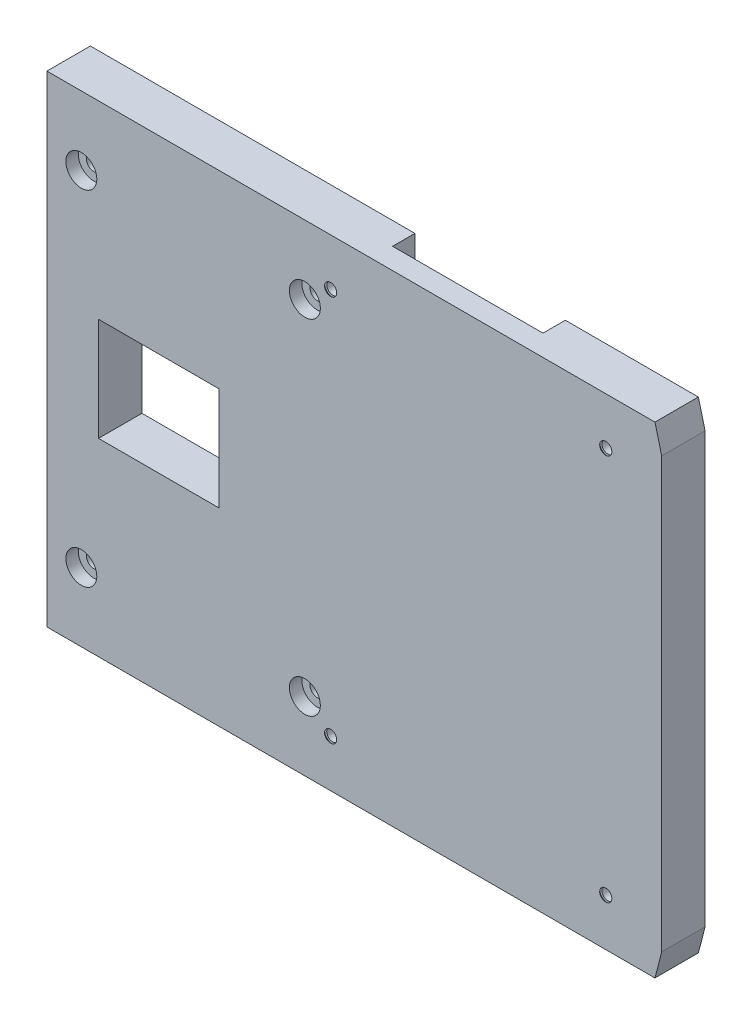
ISO-10303-21;
HEADER;
FILE_DESCRIPTION(('STEP AP214'),'2;1');
FILE_NAME('part.step','',(''),(''),'','','');
FILE_SCHEMA(('AUTOMOTIVE_DESIGN { 1 0 10303 214 1 1 1 1 }'));
ENDSEC;
DATA;
#1=APPLICATION_CONTEXT('core data for automotive mechanical design processes');
#2=APPLICATION_PROTOCOL_DEFINITION('international standard','automotive_design',2000,#1);
#3=PRODUCT_CONTEXT('',#1,'mechanical');
#4=PRODUCT('Part','Part','',(#3));
#5=PRODUCT_RELATED_PRODUCT_CATEGORY('part','',(#4));
#6=PRODUCT_DEFINITION_FORMATION('','',#4);
#7=PRODUCT_DEFINITION_CONTEXT('part definition',#1,'design');
#8=PRODUCT_DEFINITION('design','',#6,#7);
#9=PRODUCT_DEFINITION_SHAPE('','',#8);
#10=(LENGTH_UNIT() NAMED_UNIT(*) SI_UNIT(.MILLI.,.METRE.));
#11=(NAMED_UNIT(*) PLANE_ANGLE_UNIT() SI_UNIT($,.RADIAN.));
#12=(NAMED_UNIT(*) SI_UNIT($,.STERADIAN.) SOLID_ANGLE_UNIT());
#13=UNCERTAINTY_MEASURE_WITH_UNIT(LENGTH_MEASURE(1.E-05),#10,'distance_accuracy_value','');
#14=(GEOMETRIC_REPRESENTATION_CONTEXT(3) GLOBAL_UNCERTAINTY_ASSIGNED_CONTEXT((#13)) GLOBAL_UNIT_ASSIGNED_CONTEXT((#10,
#11,#12)) REPRESENTATION_CONTEXT('',''));
#15=CARTESIAN_POINT('',(0.,0.,0.));
#16=DIRECTION('',(0.,0.,1.));
#17=DIRECTION('',(1.,0.,0.));
#18=AXIS2_PLACEMENT_3D('',#15,#16,#17);
#19=CARTESIAN_POINT('',(192.,45.,221.61));
#20=DIRECTION('',(0.,0.,1.));
#21=DIRECTION('',(1.,0.,0.));
#22=AXIS2_PLACEMENT_3D('',#19,#20,#21);
#23=PLANE('',#22);
#24=CARTESIAN_POINT('',(192.,45.,221.61));
#25=DIRECTION('',(0.,0.,1.));
#26=DIRECTION('',(1.,0.,0.));
#27=AXIS2_PLACEMENT_3D('',#24,#25,#26);
#28=CIRCLE('',#27,1.4);
#29=CARTESIAN_POINT('',(193.4,45.,221.61));
#30=VERTEX_POINT('',#29);
#31=EDGE_CURVE('E9',#30,#30,#28,.T.);
#32=ORIENTED_EDGE('',*,*,#31,.F.);
#33=EDGE_LOOP('',(#32));
#34=FACE_BOUND('',#33,.T.);
#35=CARTESIAN_POINT('',(192.,45.,221.61));
#36=DIRECTION('',(0.,0.,1.));
#37=DIRECTION('',(1.,0.,0.));
#38=AXIS2_PLACEMENT_3D('',#35,#36,#37);
#39=CIRCLE('',#38,1.9);
#40=CARTESIAN_POINT('',(193.9,45.,221.61));
#41=VERTEX_POINT('',#40);
#42=EDGE_CURVE('E283',#41,#41,#39,.T.);
#43=ORIENTED_EDGE('',*,*,#42,.T.);
#44=EDGE_LOOP('',(#43));
#45=FACE_BOUND('',#44,.T.);
#46=ADVANCED_FACE('F14',(#34,#45),#23,.T.);
#47=CARTESIAN_POINT('',(128.,45.,221.61));
#48=DIRECTION('',(0.,0.,1.));
#49=DIRECTION('',(1.,0.,0.));
#50=AXIS2_PLACEMENT_3D('',#47,#48,#49);
#51=PLANE('',#50);
#52=CARTESIAN_POINT('',(128.,45.,221.61));
#53=DIRECTION('',(0.,0.,1.));
#54=DIRECTION('',(1.,0.,0.));
#55=AXIS2_PLACEMENT_3D('',#52,#53,#54);
#56=CIRCLE('',#55,1.4);
#57=CARTESIAN_POINT('',(129.4,45.,221.61));
#58=VERTEX_POINT('',#57);
#59=EDGE_CURVE('E253',#58,#58,#56,.T.);
#60=ORIENTED_EDGE('',*,*,#59,.F.);
#61=EDGE_LOOP('',(#60));
#62=FACE_BOUND('',#61,.T.);
#63=CARTESIAN_POINT('',(128.,45.,221.61));
#64=DIRECTION('',(0.,0.,1.));
#65=DIRECTION('',(1.,0.,0.));
#66=AXIS2_PLACEMENT_3D('',#63,#64,#65);
#67=CIRCLE('',#66,1.9);
#68=CARTESIAN_POINT('',(129.9,45.,221.61));
#69=VERTEX_POINT('',#68);
#70=EDGE_CURVE('E425',#69,#69,#67,.T.);
#71=ORIENTED_EDGE('',*,*,#70,.T.);
#72=EDGE_LOOP('',(#71));
#73=FACE_BOUND('',#72,.T.);
#74=ADVANCED_FACE('F661',(#62,#73),#51,.T.);
#75=CARTESIAN_POINT('',(122.,40.,219.2));
#76=DIRECTION('',(0.,0.,1.));
#77=DIRECTION('',(1.,0.,0.));
#78=AXIS2_PLACEMENT_3D('',#75,#76,#77);
#79=PLANE('',#78);
#80=CARTESIAN_POINT('',(122.,40.,219.2));
#81=DIRECTION('',(0.,0.,1.));
#82=DIRECTION('',(1.,0.,0.));
#83=AXIS2_PLACEMENT_3D('',#80,#81,#82);
#84=CIRCLE('',#83,1.7);
#85=CARTESIAN_POINT('',(123.7,40.,219.2));
#86=VERTEX_POINT('',#85);
#87=EDGE_CURVE('E238',#86,#86,#84,.T.);
#88=ORIENTED_EDGE('',*,*,#87,.F.);
#89=EDGE_LOOP('',(#88));
#90=FACE_BOUND('',#89,.T.);
#91=CARTESIAN_POINT('',(122.,40.,219.2));
#92=DIRECTION('',(0.,0.,1.));
#93=DIRECTION('',(1.,0.,0.));
#94=AXIS2_PLACEMENT_3D('',#91,#92,#93);
#95=CIRCLE('',#94,3.6);
#96=CARTESIAN_POINT('',(125.6,40.,219.2));
#97=VERTEX_POINT('',#96);
#98=EDGE_CURVE('E426',#97,#97,#95,.T.);
#99=ORIENTED_EDGE('',*,*,#98,.T.);
#100=EDGE_LOOP('',(#99));
#101=FACE_BOUND('',#100,.T.);
#102=ADVANCED_FACE('F667',(#90,#101),#79,.T.);
#103=CARTESIAN_POINT('',(70.,40.,219.2));
#104=DIRECTION('',(0.,0.,1.));
#105=DIRECTION('',(1.,0.,0.));
#106=AXIS2_PLACEMENT_3D('',#103,#104,#105);
#107=PLANE('',#106);
#108=CARTESIAN_POINT('',(70.,40.,219.2));
#109=DIRECTION('',(0.,0.,1.));
#110=DIRECTION('',(1.,0.,0.));
#111=AXIS2_PLACEMENT_3D('',#108,#109,#110);
#112=CIRCLE('',#111,1.7);
#113=CARTESIAN_POINT('',(71.7,40.,219.2));
#114=VERTEX_POINT('',#113);
#115=EDGE_CURVE('E255',#114,#114,#112,.T.);
#116=ORIENTED_EDGE('',*,*,#115,.F.);
#117=EDGE_LOOP('',(#116));
#118=FACE_BOUND('',#117,.T.);
#119=CARTESIAN_POINT('',(70.,40.,219.2));
#120=DIRECTION('',(0.,0.,1.));
#121=DIRECTION('',(1.,0.,0.));
#122=AXIS2_PLACEMENT_3D('',#119,#120,#121);
#123=CIRCLE('',#122,3.6);
#124=CARTESIAN_POINT('',(73.6,40.,219.2));
#125=VERTEX_POINT('',#124);
#126=EDGE_CURVE('E359',#125,#125,#123,.T.);
#127=ORIENTED_EDGE('',*,*,#126,.T.);
#128=EDGE_LOOP('',(#127));
#129=FACE_BOUND('',#128,.T.);
#130=ADVANCED_FACE('F571',(#118,#129),#107,.T.);
#131=CARTESIAN_POINT('',(192.,-45.,221.61));
#132=DIRECTION('',(0.,0.,1.));
#133=DIRECTION('',(1.,0.,0.));
#134=AXIS2_PLACEMENT_3D('',#131,#132,#133);
#135=PLANE('',#134);
#136=CARTESIAN_POINT('',(192.,-45.,221.61));
#137=DIRECTION('',(0.,0.,1.));
#138=DIRECTION('',(1.,0.,0.));
#139=AXIS2_PLACEMENT_3D('',#136,#137,#138);
#140=CIRCLE('',#139,1.4);
#141=CARTESIAN_POINT('',(193.4,-45.,221.61));
#142=VERTEX_POINT('',#141);
#143=EDGE_CURVE('E442',#142,#142,#140,.T.);
#144=ORIENTED_EDGE('',*,*,#143,.F.);
#145=EDGE_LOOP('',(#144));
#146=FACE_BOUND('',#145,.T.);
#147=CARTESIAN_POINT('',(192.,-45.,221.61));
#148=DIRECTION('',(0.,0.,1.));
#149=DIRECTION('',(1.,0.,0.));
#150=AXIS2_PLACEMENT_3D('',#147,#148,#149);
#151=CIRCLE('',#150,1.9);
#152=CARTESIAN_POINT('',(193.9,-45.,221.61));
#153=VERTEX_POINT('',#152);
#154=EDGE_CURVE('E350',#153,#153,#151,.T.);
#155=ORIENTED_EDGE('',*,*,#154,.T.);
#156=EDGE_LOOP('',(#155));
#157=FACE_BOUND('',#156,.T.);
#158=ADVANCED_FACE('F567',(#146,#157),#135,.T.);
#159=CARTESIAN_POINT('',(122.,-40.,219.2));
#160=DIRECTION('',(0.,0.,1.));
#161=DIRECTION('',(1.,0.,0.));
#162=AXIS2_PLACEMENT_3D('',#159,#160,#161);
#163=PLANE('',#162);
#164=CARTESIAN_POINT('',(122.,-40.,219.2));
#165=DIRECTION('',(0.,0.,1.));
#166=DIRECTION('',(1.,0.,0.));
#167=AXIS2_PLACEMENT_3D('',#164,#165,#166);
#168=CIRCLE('',#167,1.7);
#169=CARTESIAN_POINT('',(123.7,-40.,219.2));
#170=VERTEX_POINT('',#169);
#171=EDGE_CURVE('E293',#170,#170,#168,.T.);
#172=ORIENTED_EDGE('',*,*,#171,.F.);
#173=EDGE_LOOP('',(#172));
#174=FACE_BOUND('',#173,.T.);
#175=CARTESIAN_POINT('',(122.,-40.,219.2));
#176=DIRECTION('',(0.,0.,1.));
#177=DIRECTION('',(1.,0.,0.));
#178=AXIS2_PLACEMENT_3D('',#175,#176,#177);
#179=CIRCLE('',#178,3.6);
#180=CARTESIAN_POINT('',(125.6,-40.,219.2));
#181=VERTEX_POINT('',#180);
#182=EDGE_CURVE('E318',#181,#181,#179,.T.);
#183=ORIENTED_EDGE('',*,*,#182,.T.);
#184=EDGE_LOOP('',(#183));
#185=FACE_BOUND('',#184,.T.);
#186=ADVANCED_FACE('F570',(#174,#185),#163,.T.);
#187=CARTESIAN_POINT('',(128.,-45.,221.61));
#188=DIRECTION('',(0.,0.,1.));
#189=DIRECTION('',(1.,0.,0.));
#190=AXIS2_PLACEMENT_3D('',#187,#188,#189);
#191=PLANE('',#190);
#192=CARTESIAN_POINT('',(128.,-45.,221.61));
#193=DIRECTION('',(0.,0.,1.));
#194=DIRECTION('',(1.,0.,0.));
#195=AXIS2_PLACEMENT_3D('',#192,#193,#194);
#196=CIRCLE('',#195,1.4);
#197=CARTESIAN_POINT('',(129.4,-45.,221.61));
#198=VERTEX_POINT('',#197);
#199=EDGE_CURVE('E302',#198,#198,#196,.T.);
#200=ORIENTED_EDGE('',*,*,#199,.F.);
#201=EDGE_LOOP('',(#200));
#202=FACE_BOUND('',#201,.T.);
#203=CARTESIAN_POINT('',(128.,-45.,221.61));
#204=DIRECTION('',(0.,0.,1.));
#205=DIRECTION('',(1.,0.,0.));
#206=AXIS2_PLACEMENT_3D('',#203,#204,#205);
#207=CIRCLE('',#206,1.9);
#208=CARTESIAN_POINT('',(129.9,-45.,221.61));
#209=VERTEX_POINT('',#208);
#210=EDGE_CURVE('E319',#209,#209,#207,.T.);
#211=ORIENTED_EDGE('',*,*,#210,.T.);
#212=EDGE_LOOP('',(#211));
#213=FACE_BOUND('',#212,.T.);
#214=ADVANCED_FACE('F1008',(#202,#213),#191,.T.);
#215=CARTESIAN_POINT('',(70.,-40.,219.2));
#216=DIRECTION('',(0.,0.,1.));
#217=DIRECTION('',(1.,0.,0.));
#218=AXIS2_PLACEMENT_3D('',#215,#216,#217);
#219=PLANE('',#218);
#220=CARTESIAN_POINT('',(70.,-40.,219.2));
#221=DIRECTION('',(0.,0.,1.));
#222=DIRECTION('',(1.,0.,0.));
#223=AXIS2_PLACEMENT_3D('',#220,#221,#222);
#224=CIRCLE('',#223,1.7);
#225=CARTESIAN_POINT('',(71.7,-40.,219.2));
#226=VERTEX_POINT('',#225);
#227=EDGE_CURVE('E324',#226,#226,#224,.T.);
#228=ORIENTED_EDGE('',*,*,#227,.F.);
#229=EDGE_LOOP('',(#228));
#230=FACE_BOUND('',#229,.T.);
#231=CARTESIAN_POINT('',(70.,-40.,219.2));
#232=DIRECTION('',(0.,0.,1.));
#233=DIRECTION('',(1.,0.,0.));
#234=AXIS2_PLACEMENT_3D('',#231,#232,#233);
#235=CIRCLE('',#234,3.6);
#236=CARTESIAN_POINT('',(73.6,-40.,219.2));
#237=VERTEX_POINT('',#236);
#238=EDGE_CURVE('E393',#237,#237,#235,.T.);
#239=ORIENTED_EDGE('',*,*,#238,.T.);
#240=EDGE_LOOP('',(#239));
#241=FACE_BOUND('',#240,.T.);
#242=ADVANCED_FACE('F16',(#230,#241),#219,.T.);
#243=CARTESIAN_POINT('',(192.,45.,211.89));
#244=DIRECTION('',(0.,0.,1.));
#245=DIRECTION('',(1.,0.,0.));
#246=AXIS2_PLACEMENT_3D('',#243,#244,#245);
#247=CYLINDRICAL_SURFACE('',#246,1.4);
#248=CARTESIAN_POINT('',(192.,45.,212.));
#249=DIRECTION('',(0.,0.,1.));
#250=DIRECTION('',(1.,0.,0.));
#251=AXIS2_PLACEMENT_3D('',#248,#249,#250);
#252=CIRCLE('',#251,1.4);
#253=CARTESIAN_POINT('',(193.4,45.,212.));
#254=VERTEX_POINT('',#253);
#255=EDGE_CURVE('E511',#254,#254,#252,.T.);
#256=ORIENTED_EDGE('',*,*,#255,.F.);
#257=DIRECTION('',(0.,0.,1.));
#258=VECTOR('',#257,1.);
#259=CARTESIAN_POINT('',(193.4,45.,211.89));
#260=LINE('',#259,#258);
#261=EDGE_CURVE('E25',#254,#30,#260,.T.);
#262=ORIENTED_EDGE('',*,*,#261,.T.);
#263=ORIENTED_EDGE('',*,*,#31,.T.);
#264=ORIENTED_EDGE('',*,*,#261,.F.);
#265=EDGE_LOOP('',(#256,#262,#263,#264));
#266=FACE_BOUND('',#265,.T.);
#267=ADVANCED_FACE('F698',(#266),#247,.F.);
#268=CARTESIAN_POINT('',(192.,-45.,211.89));
#269=DIRECTION('',(0.,0.,1.));
#270=DIRECTION('',(1.,0.,0.));
#271=AXIS2_PLACEMENT_3D('',#268,#269,#270);
#272=CYLINDRICAL_SURFACE('',#271,1.4);
#273=CARTESIAN_POINT('',(192.,-45.,212.));
#274=DIRECTION('',(0.,0.,1.));
#275=DIRECTION('',(1.,0.,0.));
#276=AXIS2_PLACEMENT_3D('',#273,#274,#275);
#277=CIRCLE('',#276,1.4);
#278=CARTESIAN_POINT('',(193.4,-45.,212.));
#279=VERTEX_POINT('',#278);
#280=EDGE_CURVE('E281',#279,#279,#277,.T.);
#281=ORIENTED_EDGE('',*,*,#280,.F.);
#282=DIRECTION('',(0.,0.,1.));
#283=VECTOR('',#282,1.);
#284=CARTESIAN_POINT('',(193.4,-45.,211.89));
#285=LINE('',#284,#283);
#286=EDGE_CURVE('E438',#279,#142,#285,.T.);
#287=ORIENTED_EDGE('',*,*,#286,.T.);
#288=ORIENTED_EDGE('',*,*,#143,.T.);
#289=ORIENTED_EDGE('',*,*,#286,.F.);
#290=EDGE_LOOP('',(#281,#287,#288,#289));
#291=FACE_BOUND('',#290,.T.);
#292=ADVANCED_FACE('F564',(#291),#272,.F.);
#293=CARTESIAN_POINT('',(128.,45.,211.89));
#294=DIRECTION('',(0.,0.,1.));
#295=DIRECTION('',(1.,0.,0.));
#296=AXIS2_PLACEMENT_3D('',#293,#294,#295);
#297=CYLINDRICAL_SURFACE('',#296,1.4);
#298=CARTESIAN_POINT('',(128.,45.,212.));
#299=DIRECTION('',(0.,0.,1.));
#300=DIRECTION('',(1.,0.,0.));
#301=AXIS2_PLACEMENT_3D('',#298,#299,#300);
#302=CIRCLE('',#301,1.4);
#303=CARTESIAN_POINT('',(129.4,45.,212.));
#304=VERTEX_POINT('',#303);
#305=EDGE_CURVE('E346',#304,#304,#302,.T.);
#306=ORIENTED_EDGE('',*,*,#305,.F.);
#307=DIRECTION('',(0.,0.,1.));
#308=VECTOR('',#307,1.);
#309=CARTESIAN_POINT('',(129.4,45.,211.89));
#310=LINE('',#309,#308);
#311=EDGE_CURVE('E245',#304,#58,#310,.T.);
#312=ORIENTED_EDGE('',*,*,#311,.T.);
#313=ORIENTED_EDGE('',*,*,#59,.T.);
#314=ORIENTED_EDGE('',*,*,#311,.F.);
#315=EDGE_LOOP('',(#306,#312,#313,#314));
#316=FACE_BOUND('',#315,.T.);
#317=ADVANCED_FACE('F697',(#316),#297,.F.);
#318=CARTESIAN_POINT('',(122.,40.,211.99));
#319=DIRECTION('',(0.,0.,1.));
#320=DIRECTION('',(1.,0.,0.));
#321=AXIS2_PLACEMENT_3D('',#318,#319,#320);
#322=CYLINDRICAL_SURFACE('',#321,1.7);
#323=CARTESIAN_POINT('',(122.,40.,212.));
#324=DIRECTION('',(0.,0.,1.));
#325=DIRECTION('',(1.,0.,0.));
#326=AXIS2_PLACEMENT_3D('',#323,#324,#325);
#327=CIRCLE('',#326,1.7);
#328=CARTESIAN_POINT('',(123.7,40.,212.));
#329=VERTEX_POINT('',#328);
#330=EDGE_CURVE('E335',#329,#329,#327,.T.);
#331=ORIENTED_EDGE('',*,*,#330,.F.);
#332=DIRECTION('',(0.,0.,1.));
#333=VECTOR('',#332,1.);
#334=CARTESIAN_POINT('',(123.7,40.,211.99));
#335=LINE('',#334,#333);
#336=EDGE_CURVE('E241',#329,#86,#335,.T.);
#337=ORIENTED_EDGE('',*,*,#336,.T.);
#338=ORIENTED_EDGE('',*,*,#87,.T.);
#339=ORIENTED_EDGE('',*,*,#336,.F.);
#340=EDGE_LOOP('',(#331,#337,#338,#339));
#341=FACE_BOUND('',#340,.T.);
#342=ADVANCED_FACE('F240',(#341),#322,.F.);
#343=CARTESIAN_POINT('',(70.,40.,211.99));
#344=DIRECTION('',(0.,0.,1.));
#345=DIRECTION('',(1.,0.,0.));
#346=AXIS2_PLACEMENT_3D('',#343,#344,#345);
#347=CYLINDRICAL_SURFACE('',#346,1.7);
#348=CARTESIAN_POINT('',(70.,40.,212.));
#349=DIRECTION('',(0.,0.,1.));
#350=DIRECTION('',(1.,0.,0.));
#351=AXIS2_PLACEMENT_3D('',#348,#349,#350);
#352=CIRCLE('',#351,1.7);
#353=CARTESIAN_POINT('',(71.7,40.,212.));
#354=VERTEX_POINT('',#353);
#355=EDGE_CURVE('E331',#354,#354,#352,.T.);
#356=ORIENTED_EDGE('',*,*,#355,.F.);
#357=DIRECTION('',(0.,0.,1.));
#358=VECTOR('',#357,1.);
#359=CARTESIAN_POINT('',(71.7,40.,211.99));
#360=LINE('',#359,#358);
#361=EDGE_CURVE('E289',#354,#114,#360,.T.);
#362=ORIENTED_EDGE('',*,*,#361,.T.);
#363=ORIENTED_EDGE('',*,*,#115,.T.);
#364=ORIENTED_EDGE('',*,*,#361,.F.);
#365=EDGE_LOOP('',(#356,#362,#363,#364));
#366=FACE_BOUND('',#365,.T.);
#367=ADVANCED_FACE('F999',(#366),#347,.F.);
#368=CARTESIAN_POINT('',(122.,-40.,211.99));
#369=DIRECTION('',(0.,0.,1.));
#370=DIRECTION('',(1.,0.,0.));
#371=AXIS2_PLACEMENT_3D('',#368,#369,#370);
#372=CYLINDRICAL_SURFACE('',#371,1.7);
#373=CARTESIAN_POINT('',(122.,-40.,212.));
#374=DIRECTION('',(0.,0.,1.));
#375=DIRECTION('',(1.,0.,0.));
#376=AXIS2_PLACEMENT_3D('',#373,#374,#375);
#377=CIRCLE('',#376,1.7);
#378=CARTESIAN_POINT('',(123.7,-40.,212.));
#379=VERTEX_POINT('',#378);
#380=EDGE_CURVE('E481',#379,#379,#377,.T.);
#381=ORIENTED_EDGE('',*,*,#380,.F.);
#382=DIRECTION('',(0.,0.,1.));
#383=VECTOR('',#382,1.);
#384=CARTESIAN_POINT('',(123.7,-40.,211.99));
#385=LINE('',#384,#383);
#386=EDGE_CURVE('E298',#379,#170,#385,.T.);
#387=ORIENTED_EDGE('',*,*,#386,.T.);
#388=ORIENTED_EDGE('',*,*,#171,.T.);
#389=ORIENTED_EDGE('',*,*,#386,.F.);
#390=EDGE_LOOP('',(#381,#387,#388,#389));
#391=FACE_BOUND('',#390,.T.);
#392=ADVANCED_FACE('F1106',(#391),#372,.F.);
#393=CARTESIAN_POINT('',(128.,-45.,211.89));
#394=DIRECTION('',(0.,0.,1.));
#395=DIRECTION('',(1.,0.,0.));
#396=AXIS2_PLACEMENT_3D('',#393,#394,#395);
#397=CYLINDRICAL_SURFACE('',#396,1.4);
#398=CARTESIAN_POINT('',(128.,-45.,212.));
#399=DIRECTION('',(0.,0.,1.));
#400=DIRECTION('',(1.,0.,0.));
#401=AXIS2_PLACEMENT_3D('',#398,#399,#400);
#402=CIRCLE('',#401,1.4);
#403=CARTESIAN_POINT('',(129.4,-45.,212.));
#404=VERTEX_POINT('',#403);
#405=EDGE_CURVE('E373',#404,#404,#402,.T.);
#406=ORIENTED_EDGE('',*,*,#405,.F.);
#407=DIRECTION('',(0.,0.,1.));
#408=VECTOR('',#407,1.);
#409=CARTESIAN_POINT('',(129.4,-45.,211.89));
#410=LINE('',#409,#408);
#411=EDGE_CURVE('E320',#404,#198,#410,.T.);
#412=ORIENTED_EDGE('',*,*,#411,.T.);
#413=ORIENTED_EDGE('',*,*,#199,.T.);
#414=ORIENTED_EDGE('',*,*,#411,.F.);
#415=EDGE_LOOP('',(#406,#412,#413,#414));
#416=FACE_BOUND('',#415,.T.);
#417=ADVANCED_FACE('F1117',(#416),#397,.F.);
#418=CARTESIAN_POINT('',(70.,-40.,211.99));
#419=DIRECTION('',(0.,0.,1.));
#420=DIRECTION('',(1.,0.,0.));
#421=AXIS2_PLACEMENT_3D('',#418,#419,#420);
#422=CYLINDRICAL_SURFACE('',#421,1.7);
#423=CARTESIAN_POINT('',(70.,-40.,212.));
#424=DIRECTION('',(0.,0.,1.));
#425=DIRECTION('',(1.,0.,0.));
#426=AXIS2_PLACEMENT_3D('',#423,#424,#425);
#427=CIRCLE('',#426,1.7);
#428=CARTESIAN_POINT('',(71.7,-40.,212.));
#429=VERTEX_POINT('',#428);
#430=EDGE_CURVE('E312',#429,#429,#427,.T.);
#431=ORIENTED_EDGE('',*,*,#430,.F.);
#432=DIRECTION('',(0.,0.,1.));
#433=VECTOR('',#432,1.);
#434=CARTESIAN_POINT('',(71.7,-40.,211.99));
#435=LINE('',#434,#433);
#436=EDGE_CURVE('E287',#429,#226,#435,.T.);
#437=ORIENTED_EDGE('',*,*,#436,.T.);
#438=ORIENTED_EDGE('',*,*,#227,.T.);
#439=ORIENTED_EDGE('',*,*,#436,.F.);
#440=EDGE_LOOP('',(#431,#437,#438,#439));
#441=FACE_BOUND('',#440,.T.);
#442=ADVANCED_FACE('F995',(#441),#422,.F.);
#443=CARTESIAN_POINT('',(192.,45.,221.61));
#444=DIRECTION('',(0.,0.,-1.));
#445=DIRECTION('',(1.,0.,0.));
#446=AXIS2_PLACEMENT_3D('',#443,#444,#445);
#447=CONICAL_SURFACE('',#446,1.9,0.785398163397);
#448=DIRECTION('',(-0.707106781186548,0.,0.707106781186548));
#449=VECTOR('',#448,1.);
#450=CARTESIAN_POINT('',(193.9,45.,221.61));
#451=LINE('',#450,#449);
#452=CARTESIAN_POINT('',(193.41,45.,222.1));
#453=VERTEX_POINT('',#452);
#454=EDGE_CURVE('E288',#41,#453,#451,.T.);
#455=ORIENTED_EDGE('',*,*,#454,.F.);
#456=ORIENTED_EDGE('',*,*,#42,.F.);
#457=ORIENTED_EDGE('',*,*,#454,.T.);
#458=CARTESIAN_POINT('',(192.,45.,222.1));
#459=DIRECTION('',(0.,0.,1.));
#460=DIRECTION('',(1.,0.,0.));
#461=AXIS2_PLACEMENT_3D('',#458,#459,#460);
#462=CIRCLE('',#461,1.41);
#463=EDGE_CURVE('E385',#453,#453,#462,.T.);
#464=ORIENTED_EDGE('',*,*,#463,.T.);
#465=EDGE_LOOP('',(#455,#456,#457,#464));
#466=FACE_BOUND('',#465,.T.);
#467=ADVANCED_FACE('F688',(#466),#447,.F.);
#468=CARTESIAN_POINT('',(128.,45.,221.61));
#469=DIRECTION('',(0.,0.,-1.));
#470=DIRECTION('',(1.,0.,0.));
#471=AXIS2_PLACEMENT_3D('',#468,#469,#470);
#472=CONICAL_SURFACE('',#471,1.9,0.785398163397);
#473=DIRECTION('',(-0.707106781186548,0.,0.707106781186548));
#474=VECTOR('',#473,1.);
#475=CARTESIAN_POINT('',(129.9,45.,221.61));
#476=LINE('',#475,#474);
#477=CARTESIAN_POINT('',(129.41,45.,222.1));
#478=VERTEX_POINT('',#477);
#479=EDGE_CURVE('E421',#69,#478,#476,.T.);
#480=ORIENTED_EDGE('',*,*,#479,.F.);
#481=ORIENTED_EDGE('',*,*,#70,.F.);
#482=ORIENTED_EDGE('',*,*,#479,.T.);
#483=CARTESIAN_POINT('',(128.,45.,222.1));
#484=DIRECTION('',(0.,0.,1.));
#485=DIRECTION('',(1.,0.,0.));
#486=AXIS2_PLACEMENT_3D('',#483,#484,#485);
#487=CIRCLE('',#486,1.41);
#488=EDGE_CURVE('E390',#478,#478,#487,.T.);
#489=ORIENTED_EDGE('',*,*,#488,.T.);
#490=EDGE_LOOP('',(#480,#481,#482,#489));
#491=FACE_BOUND('',#490,.T.);
#492=ADVANCED_FACE('F684',(#491),#472,.F.);
#493=CARTESIAN_POINT('',(122.,40.,219.2));
#494=DIRECTION('',(0.,0.,1.));
#495=DIRECTION('',(1.,0.,0.));
#496=AXIS2_PLACEMENT_3D('',#493,#494,#495);
#497=CYLINDRICAL_SURFACE('',#496,3.6);
#498=DIRECTION('',(0.,0.,1.));
#499=VECTOR('',#498,1.);
#500=CARTESIAN_POINT('',(125.6,40.,219.2));
#501=LINE('',#500,#499);
#502=CARTESIAN_POINT('',(125.6,40.,222.1));
#503=VERTEX_POINT('',#502);
#504=EDGE_CURVE('E498',#97,#503,#501,.T.);
#505=ORIENTED_EDGE('',*,*,#504,.F.);
#506=ORIENTED_EDGE('',*,*,#98,.F.);
#507=ORIENTED_EDGE('',*,*,#504,.T.);
#508=CARTESIAN_POINT('',(122.,40.,222.1));
#509=DIRECTION('',(0.,0.,1.));
#510=DIRECTION('',(1.,0.,0.));
#511=AXIS2_PLACEMENT_3D('',#508,#509,#510);
#512=CIRCLE('',#511,3.6);
#513=EDGE_CURVE('E410',#503,#503,#512,.T.);
#514=ORIENTED_EDGE('',*,*,#513,.T.);
#515=EDGE_LOOP('',(#505,#506,#507,#514));
#516=FACE_BOUND('',#515,.T.);
#517=ADVANCED_FACE('F687',(#516),#497,.F.);
#518=CARTESIAN_POINT('',(70.,40.,219.2));
#519=DIRECTION('',(0.,0.,1.));
#520=DIRECTION('',(1.,0.,0.));
#521=AXIS2_PLACEMENT_3D('',#518,#519,#520);
#522=CYLINDRICAL_SURFACE('',#521,3.6);
#523=DIRECTION('',(0.,0.,1.));
#524=VECTOR('',#523,1.);
#525=CARTESIAN_POINT('',(73.6,40.,219.2));
#526=LINE('',#525,#524);
#527=CARTESIAN_POINT('',(73.6,40.,222.1));
#528=VERTEX_POINT('',#527);
#529=EDGE_CURVE('E356',#125,#528,#526,.T.);
#530=ORIENTED_EDGE('',*,*,#529,.F.);
#531=ORIENTED_EDGE('',*,*,#126,.F.);
#532=ORIENTED_EDGE('',*,*,#529,.T.);
#533=CARTESIAN_POINT('',(70.,40.,222.1));
#534=DIRECTION('',(0.,0.,1.));
#535=DIRECTION('',(1.,0.,0.));
#536=AXIS2_PLACEMENT_3D('',#533,#534,#535);
#537=CIRCLE('',#536,3.6);
#538=EDGE_CURVE('E414',#528,#528,#537,.T.);
#539=ORIENTED_EDGE('',*,*,#538,.T.);
#540=EDGE_LOOP('',(#530,#531,#532,#539));
#541=FACE_BOUND('',#540,.T.);
#542=ADVANCED_FACE('F715',(#541),#522,.F.);
#543=CARTESIAN_POINT('',(74.,-12.,211.));
#544=DIRECTION('',(1.,0.,0.));
#545=DIRECTION('',(0.,1.,0.));
#546=AXIS2_PLACEMENT_3D('',#543,#544,#545);
#547=PLANE('',#546);
#548=DIRECTION('',(0.,0.,1.));
#549=VECTOR('',#548,1.);
#550=CARTESIAN_POINT('',(74.,-12.,211.));
#551=LINE('',#550,#549);
#552=CARTESIAN_POINT('',(74.,-12.,212.));
#553=VERTEX_POINT('',#552);
#554=CARTESIAN_POINT('',(74.,-12.,222.1));
#555=VERTEX_POINT('',#554);
#556=EDGE_CURVE('E531',#553,#555,#551,.T.);
#557=ORIENTED_EDGE('',*,*,#556,.F.);
#558=DIRECTION('',(0.,1.,0.));
#559=VECTOR('',#558,1.);
#560=CARTESIAN_POINT('',(74.,-34.,212.));
#561=LINE('',#560,#559);
#562=CARTESIAN_POINT('',(74.,12.,212.));
#563=VERTEX_POINT('',#562);
#564=EDGE_CURVE('E384',#553,#563,#561,.T.);
#565=ORIENTED_EDGE('',*,*,#564,.T.);
#566=DIRECTION('',(0.,0.,1.));
#567=VECTOR('',#566,1.);
#568=CARTESIAN_POINT('',(74.,12.,211.));
#569=LINE('',#568,#567);
#570=CARTESIAN_POINT('',(74.,12.,222.1));
#571=VERTEX_POINT('',#570);
#572=EDGE_CURVE('E360',#563,#571,#569,.T.);
#573=ORIENTED_EDGE('',*,*,#572,.T.);
#574=DIRECTION('',(0.,1.,0.));
#575=VECTOR('',#574,1.);
#576=CARTESIAN_POINT('',(74.,-34.,222.1));
#577=LINE('',#576,#575);
#578=EDGE_CURVE('E454',#555,#571,#577,.T.);
#579=ORIENTED_EDGE('',*,*,#578,.F.);
#580=EDGE_LOOP('',(#557,#565,#573,#579));
#581=FACE_BOUND('',#580,.T.);
#582=ADVANCED_FACE('F992',(#581),#547,.T.);
#583=CARTESIAN_POINT('',(74.,12.,211.));
#584=DIRECTION('',(0.,1.,0.));
#585=DIRECTION('',(1.,0.,0.));
#586=AXIS2_PLACEMENT_3D('',#583,#584,#585);
#587=PLANE('',#586);
#588=DIRECTION('',(-1.,0.,0.));
#589=VECTOR('',#588,1.);
#590=CARTESIAN_POINT('',(68.,12.,222.1));
#591=LINE('',#590,#589);
#592=CARTESIAN_POINT('',(102.,12.,222.1));
#593=VERTEX_POINT('',#592);
#594=EDGE_CURVE('E449',#593,#571,#591,.T.);
#595=ORIENTED_EDGE('',*,*,#594,.T.);
#596=ORIENTED_EDGE('',*,*,#572,.F.);
#597=DIRECTION('',(-1.,0.,0.));
#598=VECTOR('',#597,1.);
#599=CARTESIAN_POINT('',(68.,12.,212.));
#600=LINE('',#599,#598);
#601=CARTESIAN_POINT('',(102.,12.,212.));
#602=VERTEX_POINT('',#601);
#603=EDGE_CURVE('E405',#602,#563,#600,.T.);
#604=ORIENTED_EDGE('',*,*,#603,.F.);
#605=DIRECTION('',(0.,0.,1.));
#606=VECTOR('',#605,1.);
#607=CARTESIAN_POINT('',(102.,12.,211.));
#608=LINE('',#607,#606);
#609=EDGE_CURVE('E417',#602,#593,#608,.T.);
#610=ORIENTED_EDGE('',*,*,#609,.T.);
#611=EDGE_LOOP('',(#595,#596,#604,#610));
#612=FACE_BOUND('',#611,.T.);
#613=ADVANCED_FACE('F641',(#612),#587,.F.);
#614=CARTESIAN_POINT('',(102.,-12.,211.));
#615=DIRECTION('',(1.,0.,0.));
#616=DIRECTION('',(0.,1.,0.));
#617=AXIS2_PLACEMENT_3D('',#614,#615,#616);
#618=PLANE('',#617);
#619=DIRECTION('',(0.,1.,0.));
#620=VECTOR('',#619,1.);
#621=CARTESIAN_POINT('',(102.,-34.,222.1));
#622=LINE('',#621,#620);
#623=CARTESIAN_POINT('',(102.,-12.,222.1));
#624=VERTEX_POINT('',#623);
#625=EDGE_CURVE('E453',#624,#593,#622,.T.);
#626=ORIENTED_EDGE('',*,*,#625,.T.);
#627=ORIENTED_EDGE('',*,*,#609,.F.);
#628=DIRECTION('',(0.,1.,0.));
#629=VECTOR('',#628,1.);
#630=CARTESIAN_POINT('',(102.,-34.,212.));
#631=LINE('',#630,#629);
#632=CARTESIAN_POINT('',(102.,-12.,212.));
#633=VERTEX_POINT('',#632);
#634=EDGE_CURVE('E409',#633,#602,#631,.T.);
#635=ORIENTED_EDGE('',*,*,#634,.F.);
#636=DIRECTION('',(0.,0.,1.));
#637=VECTOR('',#636,1.);
#638=CARTESIAN_POINT('',(102.,-12.,211.));
#639=LINE('',#638,#637);
#640=EDGE_CURVE('E513',#633,#624,#639,.T.);
#641=ORIENTED_EDGE('',*,*,#640,.T.);
#642=EDGE_LOOP('',(#626,#627,#635,#641));
#643=FACE_BOUND('',#642,.T.);
#644=ADVANCED_FACE('F636',(#643),#618,.F.);
#645=CARTESIAN_POINT('',(74.,-12.,211.));
#646=DIRECTION('',(0.,1.,0.));
#647=DIRECTION('',(1.,0.,0.));
#648=AXIS2_PLACEMENT_3D('',#645,#646,#647);
#649=PLANE('',#648);
#650=ORIENTED_EDGE('',*,*,#640,.F.);
#651=DIRECTION('',(-1.,0.,0.));
#652=VECTOR('',#651,1.);
#653=CARTESIAN_POINT('',(68.,-12.,212.));
#654=LINE('',#653,#652);
#655=EDGE_CURVE('E336',#633,#553,#654,.T.);
#656=ORIENTED_EDGE('',*,*,#655,.T.);
#657=ORIENTED_EDGE('',*,*,#556,.T.);
#658=DIRECTION('',(-1.,0.,0.));
#659=VECTOR('',#658,1.);
#660=CARTESIAN_POINT('',(68.,-12.,222.1));
#661=LINE('',#660,#659);
#662=EDGE_CURVE('E476',#624,#555,#661,.T.);
#663=ORIENTED_EDGE('',*,*,#662,.F.);
#664=EDGE_LOOP('',(#650,#656,#657,#663));
#665=FACE_BOUND('',#664,.T.);
#666=ADVANCED_FACE('F647',(#665),#649,.T.);
#667=CARTESIAN_POINT('',(192.,-45.,221.61));
#668=DIRECTION('',(0.,0.,-1.));
#669=DIRECTION('',(1.,0.,0.));
#670=AXIS2_PLACEMENT_3D('',#667,#668,#669);
#671=CONICAL_SURFACE('',#670,1.9,0.785398163397);
#672=DIRECTION('',(-0.707106781186548,0.,0.707106781186548));
#673=VECTOR('',#672,1.);
#674=CARTESIAN_POINT('',(193.9,-45.,221.61));
#675=LINE('',#674,#673);
#676=CARTESIAN_POINT('',(193.41,-45.,222.1));
#677=VERTEX_POINT('',#676);
#678=EDGE_CURVE('E347',#153,#677,#675,.T.);
#679=ORIENTED_EDGE('',*,*,#678,.F.);
#680=ORIENTED_EDGE('',*,*,#154,.F.);
#681=ORIENTED_EDGE('',*,*,#678,.T.);
#682=CARTESIAN_POINT('',(192.,-45.,222.1));
#683=DIRECTION('',(0.,0.,1.));
#684=DIRECTION('',(1.,0.,0.));
#685=AXIS2_PLACEMENT_3D('',#682,#683,#684);
#686=CIRCLE('',#685,1.41);
#687=EDGE_CURVE('E488',#677,#677,#686,.T.);
#688=ORIENTED_EDGE('',*,*,#687,.T.);
#689=EDGE_LOOP('',(#679,#680,#681,#688));
#690=FACE_BOUND('',#689,.T.);
#691=ADVANCED_FACE('F576',(#690),#671,.F.);
#692=CARTESIAN_POINT('',(122.,-40.,219.2));
#693=DIRECTION('',(0.,0.,1.));
#694=DIRECTION('',(1.,0.,0.));
#695=AXIS2_PLACEMENT_3D('',#692,#693,#694);
#696=CYLINDRICAL_SURFACE('',#695,3.6);
#697=DIRECTION('',(0.,0.,1.));
#698=VECTOR('',#697,1.);
#699=CARTESIAN_POINT('',(125.6,-40.,219.2));
#700=LINE('',#699,#698);
#701=CARTESIAN_POINT('',(125.6,-40.,222.1));
#702=VERTEX_POINT('',#701);
#703=EDGE_CURVE('E314',#181,#702,#700,.T.);
#704=ORIENTED_EDGE('',*,*,#703,.F.);
#705=ORIENTED_EDGE('',*,*,#182,.F.);
#706=ORIENTED_EDGE('',*,*,#703,.T.);
#707=CARTESIAN_POINT('',(122.,-40.,222.1));
#708=DIRECTION('',(0.,0.,1.));
#709=DIRECTION('',(1.,0.,0.));
#710=AXIS2_PLACEMENT_3D('',#707,#708,#709);
#711=CIRCLE('',#710,3.6);
#712=EDGE_CURVE('E446',#702,#702,#711,.T.);
#713=ORIENTED_EDGE('',*,*,#712,.T.);
#714=EDGE_LOOP('',(#704,#705,#706,#713));
#715=FACE_BOUND('',#714,.T.);
#716=ADVANCED_FACE('F655',(#715),#696,.F.);
#717=CARTESIAN_POINT('',(128.,-45.,221.61));
#718=DIRECTION('',(0.,0.,-1.));
#719=DIRECTION('',(1.,0.,0.));
#720=AXIS2_PLACEMENT_3D('',#717,#718,#719);
#721=CONICAL_SURFACE('',#720,1.9,0.785398163397);
#722=DIRECTION('',(-0.707106781186548,0.,0.707106781186548));
#723=VECTOR('',#722,1.);
#724=CARTESIAN_POINT('',(129.9,-45.,221.61));
#725=LINE('',#724,#723);
#726=CARTESIAN_POINT('',(129.41,-45.,222.1));
#727=VERTEX_POINT('',#726);
#728=EDGE_CURVE('E472',#209,#727,#725,.T.);
#729=ORIENTED_EDGE('',*,*,#728,.F.);
#730=ORIENTED_EDGE('',*,*,#210,.F.);
#731=ORIENTED_EDGE('',*,*,#728,.T.);
#732=CARTESIAN_POINT('',(128.,-45.,222.1));
#733=DIRECTION('',(0.,0.,1.));
#734=DIRECTION('',(1.,0.,0.));
#735=AXIS2_PLACEMENT_3D('',#732,#733,#734);
#736=CIRCLE('',#735,1.41);
#737=EDGE_CURVE('E307',#727,#727,#736,.T.);
#738=ORIENTED_EDGE('',*,*,#737,.T.);
#739=EDGE_LOOP('',(#729,#730,#731,#738));
#740=FACE_BOUND('',#739,.T.);
#741=ADVANCED_FACE('F673',(#740),#721,.F.);
#742=CARTESIAN_POINT('',(70.,-40.,219.2));
#743=DIRECTION('',(0.,0.,1.));
#744=DIRECTION('',(1.,0.,0.));
#745=AXIS2_PLACEMENT_3D('',#742,#743,#744);
#746=CYLINDRICAL_SURFACE('',#745,3.6);
#747=DIRECTION('',(0.,0.,1.));
#748=VECTOR('',#747,1.);
#749=CARTESIAN_POINT('',(73.6,-40.,219.2));
#750=LINE('',#749,#748);
#751=CARTESIAN_POINT('',(73.6,-40.,222.1));
#752=VERTEX_POINT('',#751);
#753=EDGE_CURVE('E342',#237,#752,#750,.T.);
#754=ORIENTED_EDGE('',*,*,#753,.F.);
#755=ORIENTED_EDGE('',*,*,#238,.F.);
#756=ORIENTED_EDGE('',*,*,#753,.T.);
#757=CARTESIAN_POINT('',(70.,-40.,222.1));
#758=DIRECTION('',(0.,0.,1.));
#759=DIRECTION('',(1.,0.,0.));
#760=AXIS2_PLACEMENT_3D('',#757,#758,#759);
#761=CIRCLE('',#760,3.6);
#762=EDGE_CURVE('E303',#752,#752,#761,.T.);
#763=ORIENTED_EDGE('',*,*,#762,.T.);
#764=EDGE_LOOP('',(#754,#755,#756,#763));
#765=FACE_BOUND('',#764,.T.);
#766=ADVANCED_FACE('F692',(#765),#746,.F.);
#767=CARTESIAN_POINT('',(205.,-56.,212.));
#768=DIRECTION('',(1.,0.,0.));
#769=DIRECTION('',(0.,1.,0.));
#770=AXIS2_PLACEMENT_3D('',#767,#768,#769);
#771=PLANE('',#770);
#772=DIRECTION('',(0.,1.,0.));
#773=VECTOR('',#772,1.);
#774=CARTESIAN_POINT('',(205.,-56.,222.1));
#775=LINE('',#774,#773);
#776=CARTESIAN_POINT('',(205.,-49.95998398718,222.1));
#777=VERTEX_POINT('',#776);
#778=CARTESIAN_POINT('',(205.,49.959983987187,222.1));
#779=VERTEX_POINT('',#778);
#780=EDGE_CURVE('E374',#777,#779,#775,.T.);
#781=ORIENTED_EDGE('',*,*,#780,.F.);
#782=DIRECTION('',(0.,0.,1.));
#783=VECTOR('',#782,1.);
#784=CARTESIAN_POINT('',(205.,-49.95998398718,150.));
#785=LINE('',#784,#783);
#786=CARTESIAN_POINT('',(205.,-49.95998398718,212.));
#787=VERTEX_POINT('',#786);
#788=EDGE_CURVE('E343',#787,#777,#785,.T.);
#789=ORIENTED_EDGE('',*,*,#788,.F.);
#790=DIRECTION('',(0.,1.,0.));
#791=VECTOR('',#790,1.);
#792=CARTESIAN_POINT('',(205.,-56.,212.));
#793=LINE('',#792,#791);
#794=CARTESIAN_POINT('',(205.,49.959983987187,212.));
#795=VERTEX_POINT('',#794);
#796=EDGE_CURVE('E282',#787,#795,#793,.T.);
#797=ORIENTED_EDGE('',*,*,#796,.T.);
#798=DIRECTION('',(0.,0.,1.));
#799=VECTOR('',#798,1.);
#800=CARTESIAN_POINT('',(205.,49.959983987187,150.));
#801=LINE('',#800,#799);
#802=EDGE_CURVE('E339',#795,#779,#801,.T.);
#803=ORIENTED_EDGE('',*,*,#802,.T.);
#804=EDGE_LOOP('',(#781,#789,#797,#803));
#805=FACE_BOUND('',#804,.T.);
#806=ADVANCED_FACE('F611',(#805),#771,.T.);
#807=CARTESIAN_POINT('',(0.,0.,150.));
#808=DIRECTION('',(0.,0.,1.));
#809=DIRECTION('',(1.,0.,0.));
#810=AXIS2_PLACEMENT_3D('',#807,#808,#809);
#811=CYLINDRICAL_SURFACE('',#810,211.);
#812=ORIENTED_EDGE('',*,*,#802,.F.);
#813=CARTESIAN_POINT('',(0.,0.,212.));
#814=DIRECTION('',(0.,0.,1.));
#815=DIRECTION('',(1.,0.,0.));
#816=AXIS2_PLACEMENT_3D('',#813,#814,#815);
#817=CIRCLE('',#816,211.);
#818=CARTESIAN_POINT('',(203.4330356653,56.,212.));
#819=VERTEX_POINT('',#818);
#820=EDGE_CURVE('E275',#795,#819,#817,.T.);
#821=ORIENTED_EDGE('',*,*,#820,.T.);
#822=DIRECTION('',(0.,0.,1.));
#823=VECTOR('',#822,1.);
#824=CARTESIAN_POINT('',(203.4330356653,56.,150.));
#825=LINE('',#824,#823);
#826=CARTESIAN_POINT('',(203.4330356653,56.,222.1));
#827=VERTEX_POINT('',#826);
#828=EDGE_CURVE('E270',#819,#827,#825,.T.);
#829=ORIENTED_EDGE('',*,*,#828,.T.);
#830=CARTESIAN_POINT('',(0.,0.,222.1));
#831=DIRECTION('',(0.,0.,1.));
#832=DIRECTION('',(1.,0.,0.));
#833=AXIS2_PLACEMENT_3D('',#830,#831,#832);
#834=CIRCLE('',#833,211.);
#835=EDGE_CURVE('E308',#779,#827,#834,.T.);
#836=ORIENTED_EDGE('',*,*,#835,.F.);
#837=EDGE_LOOP('',(#812,#821,#829,#836));
#838=FACE_BOUND('',#837,.T.);
#839=ADVANCED_FACE('F615',(#838),#811,.T.);
#840=CARTESIAN_POINT('',(0.,0.,150.));
#841=DIRECTION('',(0.,0.,1.));
#842=DIRECTION('',(1.,0.,0.));
#843=AXIS2_PLACEMENT_3D('',#840,#841,#842);
#844=CYLINDRICAL_SURFACE('',#843,211.);
#845=CARTESIAN_POINT('',(0.,0.,212.));
#846=DIRECTION('',(0.,0.,1.));
#847=DIRECTION('',(1.,0.,0.));
#848=AXIS2_PLACEMENT_3D('',#845,#846,#847);
#849=CIRCLE('',#848,211.);
#850=CARTESIAN_POINT('',(203.4330356653,-56.,212.));
#851=VERTEX_POINT('',#850);
#852=EDGE_CURVE('E277',#851,#787,#849,.T.);
#853=ORIENTED_EDGE('',*,*,#852,.T.);
#854=ORIENTED_EDGE('',*,*,#788,.T.);
#855=CARTESIAN_POINT('',(0.,0.,222.1));
#856=DIRECTION('',(0.,0.,1.));
#857=DIRECTION('',(1.,0.,0.));
#858=AXIS2_PLACEMENT_3D('',#855,#856,#857);
#859=CIRCLE('',#858,211.);
#860=CARTESIAN_POINT('',(203.4330356653,-56.,222.1));
#861=VERTEX_POINT('',#860);
#862=EDGE_CURVE('E368',#861,#777,#859,.T.);
#863=ORIENTED_EDGE('',*,*,#862,.F.);
#864=DIRECTION('',(0.,0.,1.));
#865=VECTOR('',#864,1.);
#866=CARTESIAN_POINT('',(203.4330356653,-56.,150.));
#867=LINE('',#866,#865);
#868=EDGE_CURVE('E264',#851,#861,#867,.T.);
#869=ORIENTED_EDGE('',*,*,#868,.F.);
#870=EDGE_LOOP('',(#853,#854,#863,#869));
#871=FACE_BOUND('',#870,.T.);
#872=ADVANCED_FACE('F608',(#871),#844,.T.);
#873=CARTESIAN_POINT('',(62.,-56.,212.));
#874=DIRECTION('',(0.,0.,1.));
#875=DIRECTION('',(1.,0.,0.));
#876=AXIS2_PLACEMENT_3D('',#873,#874,#875);
#877=PLANE('',#876);
#878=ORIENTED_EDGE('',*,*,#255,.T.);
#879=EDGE_LOOP('',(#878));
#880=FACE_BOUND('',#879,.T.);
#881=ORIENTED_EDGE('',*,*,#280,.T.);
#882=EDGE_LOOP('',(#881));
#883=FACE_BOUND('',#882,.T.);
#884=ORIENTED_EDGE('',*,*,#820,.F.);
#885=ORIENTED_EDGE('',*,*,#796,.F.);
#886=ORIENTED_EDGE('',*,*,#852,.F.);
#887=DIRECTION('',(1.,0.,0.));
#888=VECTOR('',#887,1.);
#889=CARTESIAN_POINT('',(62.,-56.,212.));
#890=LINE('',#889,#888);
#891=CARTESIAN_POINT('',(172.5,-56.,212.));
#892=VERTEX_POINT('',#891);
#893=EDGE_CURVE('E260',#892,#851,#890,.T.);
#894=ORIENTED_EDGE('',*,*,#893,.F.);
#895=DIRECTION('',(0.,1.,0.));
#896=VECTOR('',#895,1.);
#897=CARTESIAN_POINT('',(172.5,-57.,212.));
#898=LINE('',#897,#896);
#899=CARTESIAN_POINT('',(172.5,56.,212.));
#900=VERTEX_POINT('',#899);
#901=EDGE_CURVE('E271',#892,#900,#898,.T.);
#902=ORIENTED_EDGE('',*,*,#901,.T.);
#903=DIRECTION('',(1.,0.,0.));
#904=VECTOR('',#903,1.);
#905=CARTESIAN_POINT('',(62.,56.,212.));
#906=LINE('',#905,#904);
#907=EDGE_CURVE('E266',#900,#819,#906,.T.);
#908=ORIENTED_EDGE('',*,*,#907,.T.);
#909=EDGE_LOOP('',(#884,#885,#886,#894,#902,#908));
#910=FACE_BOUND('',#909,.T.);
#911=ADVANCED_FACE('F561',(#880,#883,#910),#877,.F.);
#912=CARTESIAN_POINT('',(172.5,-57.,212.));
#913=DIRECTION('',(1.,0.,0.));
#914=DIRECTION('',(0.,1.,0.));
#915=AXIS2_PLACEMENT_3D('',#912,#913,#914);
#916=PLANE('',#915);
#917=DIRECTION('',(0.,0.,-1.));
#918=VECTOR('',#917,1.);
#919=CARTESIAN_POINT('',(172.5,56.,212.));
#920=LINE('',#919,#918);
#921=CARTESIAN_POINT('',(172.5,56.,217.2));
#922=VERTEX_POINT('',#921);
#923=EDGE_CURVE('E18',#922,#900,#920,.T.);
#924=ORIENTED_EDGE('',*,*,#923,.T.);
#925=ORIENTED_EDGE('',*,*,#901,.F.);
#926=DIRECTION('',(0.,0.,-1.));
#927=VECTOR('',#926,1.);
#928=CARTESIAN_POINT('',(172.5,-56.,212.));
#929=LINE('',#928,#927);
#930=CARTESIAN_POINT('',(172.5,-56.,217.2));
#931=VERTEX_POINT('',#930);
#932=EDGE_CURVE('E265',#931,#892,#929,.T.);
#933=ORIENTED_EDGE('',*,*,#932,.F.);
#934=DIRECTION('',(0.,1.,0.));
#935=VECTOR('',#934,1.);
#936=CARTESIAN_POINT('',(172.5,-57.,217.2));
#937=LINE('',#936,#935);
#938=EDGE_CURVE('E276',#931,#922,#937,.T.);
#939=ORIENTED_EDGE('',*,*,#938,.T.);
#940=EDGE_LOOP('',(#924,#925,#933,#939));
#941=FACE_BOUND('',#940,.T.);
#942=ADVANCED_FACE('F680',(#941),#916,.F.);
#943=CARTESIAN_POINT('',(137.5,-57.,217.2));
#944=DIRECTION('',(0.,0.,1.));
#945=DIRECTION('',(1.,0.,0.));
#946=AXIS2_PLACEMENT_3D('',#943,#944,#945);
#947=PLANE('',#946);
#948=DIRECTION('',(1.,0.,0.));
#949=VECTOR('',#948,1.);
#950=CARTESIAN_POINT('',(99.75,56.,217.2));
#951=LINE('',#950,#949);
#952=CARTESIAN_POINT('',(137.5,56.,217.2));
#953=VERTEX_POINT('',#952);
#954=EDGE_CURVE('E458',#953,#922,#951,.T.);
#955=ORIENTED_EDGE('',*,*,#954,.T.);
#956=ORIENTED_EDGE('',*,*,#938,.F.);
#957=DIRECTION('',(1.,0.,0.));
#958=VECTOR('',#957,1.);
#959=CARTESIAN_POINT('',(99.75,-56.,217.2));
#960=LINE('',#959,#958);
#961=CARTESIAN_POINT('',(137.5,-56.,217.2));
#962=VERTEX_POINT('',#961);
#963=EDGE_CURVE('E329',#962,#931,#960,.T.);
#964=ORIENTED_EDGE('',*,*,#963,.F.);
#965=DIRECTION('',(0.,1.,0.));
#966=VECTOR('',#965,1.);
#967=CARTESIAN_POINT('',(137.5,-57.,217.2));
#968=LINE('',#967,#966);
#969=EDGE_CURVE('E355',#962,#953,#968,.T.);
#970=ORIENTED_EDGE('',*,*,#969,.T.);
#971=EDGE_LOOP('',(#955,#956,#964,#970));
#972=FACE_BOUND('',#971,.T.);
#973=ADVANCED_FACE('F678',(#972),#947,.F.);
#974=CARTESIAN_POINT('',(137.5,-57.,212.));
#975=DIRECTION('',(1.,0.,0.));
#976=DIRECTION('',(0.,1.,0.));
#977=AXIS2_PLACEMENT_3D('',#974,#975,#976);
#978=PLANE('',#977);
#979=ORIENTED_EDGE('',*,*,#969,.F.);
#980=DIRECTION('',(0.,0.,-1.));
#981=VECTOR('',#980,1.);
#982=CARTESIAN_POINT('',(137.5,-56.,212.));
#983=LINE('',#982,#981);
#984=CARTESIAN_POINT('',(137.5,-56.,212.));
#985=VERTEX_POINT('',#984);
#986=EDGE_CURVE('E325',#962,#985,#983,.T.);
#987=ORIENTED_EDGE('',*,*,#986,.T.);
#988=DIRECTION('',(0.,1.,0.));
#989=VECTOR('',#988,1.);
#990=CARTESIAN_POINT('',(137.5,-57.,212.));
#991=LINE('',#990,#989);
#992=CARTESIAN_POINT('',(137.5,56.,212.));
#993=VERTEX_POINT('',#992);
#994=EDGE_CURVE('E309',#985,#993,#991,.T.);
#995=ORIENTED_EDGE('',*,*,#994,.T.);
#996=DIRECTION('',(0.,0.,-1.));
#997=VECTOR('',#996,1.);
#998=CARTESIAN_POINT('',(137.5,56.,212.));
#999=LINE('',#998,#997);
#1000=EDGE_CURVE('E313',#953,#993,#999,.T.);
#1001=ORIENTED_EDGE('',*,*,#1000,.F.);
#1002=EDGE_LOOP('',(#979,#987,#995,#1001));
#1003=FACE_BOUND('',#1002,.T.);
#1004=ADVANCED_FACE('F675',(#1003),#978,.T.);
#1005=CARTESIAN_POINT('',(62.,-56.,212.));
#1006=DIRECTION('',(0.,0.,1.));
#1007=DIRECTION('',(1.,0.,0.));
#1008=AXIS2_PLACEMENT_3D('',#1005,#1006,#1007);
#1009=PLANE('',#1008);
#1010=ORIENTED_EDGE('',*,*,#305,.T.);
#1011=EDGE_LOOP('',(#1010));
#1012=FACE_BOUND('',#1011,.T.);
#1013=ORIENTED_EDGE('',*,*,#330,.T.);
#1014=EDGE_LOOP('',(#1013));
#1015=FACE_BOUND('',#1014,.T.);
#1016=ORIENTED_EDGE('',*,*,#355,.T.);
#1017=EDGE_LOOP('',(#1016));
#1018=FACE_BOUND('',#1017,.T.);
#1019=ORIENTED_EDGE('',*,*,#634,.T.);
#1020=ORIENTED_EDGE('',*,*,#603,.T.);
#1021=ORIENTED_EDGE('',*,*,#564,.F.);
#1022=ORIENTED_EDGE('',*,*,#655,.F.);
#1023=EDGE_LOOP('',(#1019,#1020,#1021,#1022));
#1024=FACE_BOUND('',#1023,.T.);
#1025=ORIENTED_EDGE('',*,*,#380,.T.);
#1026=EDGE_LOOP('',(#1025));
#1027=FACE_BOUND('',#1026,.T.);
#1028=ORIENTED_EDGE('',*,*,#405,.T.);
#1029=EDGE_LOOP('',(#1028));
#1030=FACE_BOUND('',#1029,.T.);
#1031=ORIENTED_EDGE('',*,*,#430,.T.);
#1032=EDGE_LOOP('',(#1031));
#1033=FACE_BOUND('',#1032,.T.);
#1034=ORIENTED_EDGE('',*,*,#994,.F.);
#1035=DIRECTION('',(1.,0.,0.));
#1036=VECTOR('',#1035,1.);
#1037=CARTESIAN_POINT('',(62.,-56.,212.));
#1038=LINE('',#1037,#1036);
#1039=CARTESIAN_POINT('',(62.,-56.,212.));
#1040=VERTEX_POINT('',#1039);
#1041=EDGE_CURVE('E369',#1040,#985,#1038,.T.);
#1042=ORIENTED_EDGE('',*,*,#1041,.F.);
#1043=DIRECTION('',(0.,1.,0.));
#1044=VECTOR('',#1043,1.);
#1045=CARTESIAN_POINT('',(62.,-56.,212.));
#1046=LINE('',#1045,#1044);
#1047=CARTESIAN_POINT('',(62.,56.,212.));
#1048=VERTEX_POINT('',#1047);
#1049=EDGE_CURVE('E400',#1040,#1048,#1046,.T.);
#1050=ORIENTED_EDGE('',*,*,#1049,.T.);
#1051=DIRECTION('',(1.,0.,0.));
#1052=VECTOR('',#1051,1.);
#1053=CARTESIAN_POINT('',(62.,56.,212.));
#1054=LINE('',#1053,#1052);
#1055=EDGE_CURVE('E389',#1048,#993,#1054,.T.);
#1056=ORIENTED_EDGE('',*,*,#1055,.T.);
#1057=EDGE_LOOP('',(#1034,#1042,#1050,#1056));
#1058=FACE_BOUND('',#1057,.T.);
#1059=ADVANCED_FACE('F645',(#1012,#1015,#1018,#1024,#1027,#1030,#1033,#1058),#1009,.F.);
#1060=CARTESIAN_POINT('',(62.,56.,212.));
#1061=DIRECTION('',(0.,1.,0.));
#1062=DIRECTION('',(1.,0.,0.));
#1063=AXIS2_PLACEMENT_3D('',#1060,#1061,#1062);
#1064=PLANE('',#1063);
#1065=ORIENTED_EDGE('',*,*,#1055,.F.);
#1066=DIRECTION('',(0.,0.,1.));
#1067=VECTOR('',#1066,1.);
#1068=CARTESIAN_POINT('',(62.,56.,212.));
#1069=LINE('',#1068,#1067);
#1070=CARTESIAN_POINT('',(62.,56.,222.1));
#1071=VERTEX_POINT('',#1070);
#1072=EDGE_CURVE('E396',#1048,#1071,#1069,.T.);
#1073=ORIENTED_EDGE('',*,*,#1072,.T.);
#1074=DIRECTION('',(1.,0.,0.));
#1075=VECTOR('',#1074,1.);
#1076=CARTESIAN_POINT('',(62.,56.,222.1));
#1077=LINE('',#1076,#1075);
#1078=EDGE_CURVE('E364',#1071,#827,#1077,.T.);
#1079=ORIENTED_EDGE('',*,*,#1078,.T.);
#1080=ORIENTED_EDGE('',*,*,#828,.F.);
#1081=ORIENTED_EDGE('',*,*,#907,.F.);
#1082=ORIENTED_EDGE('',*,*,#923,.F.);
#1083=ORIENTED_EDGE('',*,*,#954,.F.);
#1084=ORIENTED_EDGE('',*,*,#1000,.T.);
#1085=EDGE_LOOP('',(#1065,#1073,#1079,#1080,#1081,#1082,#1083,#1084));
#1086=FACE_BOUND('',#1085,.T.);
#1087=ADVANCED_FACE('F583',(#1086),#1064,.T.);
#1088=CARTESIAN_POINT('',(62.,-56.,222.1));
#1089=DIRECTION('',(0.,0.,1.));
#1090=DIRECTION('',(1.,0.,0.));
#1091=AXIS2_PLACEMENT_3D('',#1088,#1089,#1090);
#1092=PLANE('',#1091);
#1093=ORIENTED_EDGE('',*,*,#463,.F.);
#1094=EDGE_LOOP('',(#1093));
#1095=FACE_BOUND('',#1094,.T.);
#1096=ORIENTED_EDGE('',*,*,#488,.F.);
#1097=EDGE_LOOP('',(#1096));
#1098=FACE_BOUND('',#1097,.T.);
#1099=ORIENTED_EDGE('',*,*,#513,.F.);
#1100=EDGE_LOOP('',(#1099));
#1101=FACE_BOUND('',#1100,.T.);
#1102=ORIENTED_EDGE('',*,*,#538,.F.);
#1103=EDGE_LOOP('',(#1102));
#1104=FACE_BOUND('',#1103,.T.);
#1105=ORIENTED_EDGE('',*,*,#662,.T.);
#1106=ORIENTED_EDGE('',*,*,#578,.T.);
#1107=ORIENTED_EDGE('',*,*,#594,.F.);
#1108=ORIENTED_EDGE('',*,*,#625,.F.);
#1109=EDGE_LOOP('',(#1105,#1106,#1107,#1108));
#1110=FACE_BOUND('',#1109,.T.);
#1111=ORIENTED_EDGE('',*,*,#687,.F.);
#1112=EDGE_LOOP('',(#1111));
#1113=FACE_BOUND('',#1112,.T.);
#1114=ORIENTED_EDGE('',*,*,#712,.F.);
#1115=EDGE_LOOP('',(#1114));
#1116=FACE_BOUND('',#1115,.T.);
#1117=ORIENTED_EDGE('',*,*,#737,.F.);
#1118=EDGE_LOOP('',(#1117));
#1119=FACE_BOUND('',#1118,.T.);
#1120=ORIENTED_EDGE('',*,*,#762,.F.);
#1121=EDGE_LOOP('',(#1120));
#1122=FACE_BOUND('',#1121,.T.);
#1123=ORIENTED_EDGE('',*,*,#1078,.F.);
#1124=DIRECTION('',(0.,1.,0.));
#1125=VECTOR('',#1124,1.);
#1126=CARTESIAN_POINT('',(62.,-56.,222.1));
#1127=LINE('',#1126,#1125);
#1128=CARTESIAN_POINT('',(62.,-56.,222.1));
#1129=VERTEX_POINT('',#1128);
#1130=EDGE_CURVE('E401',#1129,#1071,#1127,.T.);
#1131=ORIENTED_EDGE('',*,*,#1130,.F.);
#1132=DIRECTION('',(1.,0.,0.));
#1133=VECTOR('',#1132,1.);
#1134=CARTESIAN_POINT('',(62.,-56.,222.1));
#1135=LINE('',#1134,#1133);
#1136=EDGE_CURVE('E297',#1129,#861,#1135,.T.);
#1137=ORIENTED_EDGE('',*,*,#1136,.T.);
#1138=ORIENTED_EDGE('',*,*,#862,.T.);
#1139=ORIENTED_EDGE('',*,*,#780,.T.);
#1140=ORIENTED_EDGE('',*,*,#835,.T.);
#1141=EDGE_LOOP('',(#1123,#1131,#1137,#1138,#1139,#1140));
#1142=FACE_BOUND('',#1141,.T.);
#1143=ADVANCED_FACE('F579',(#1095,#1098,#1101,#1104,#1110,#1113,#1116,#1119,#1122,#1142),#1092,.T.);
#1144=CARTESIAN_POINT('',(62.,-56.,212.));
#1145=DIRECTION('',(0.,1.,0.));
#1146=DIRECTION('',(1.,0.,0.));
#1147=AXIS2_PLACEMENT_3D('',#1144,#1145,#1146);
#1148=PLANE('',#1147);
#1149=ORIENTED_EDGE('',*,*,#986,.F.);
#1150=ORIENTED_EDGE('',*,*,#963,.T.);
#1151=ORIENTED_EDGE('',*,*,#932,.T.);
#1152=ORIENTED_EDGE('',*,*,#893,.T.);
#1153=ORIENTED_EDGE('',*,*,#868,.T.);
#1154=ORIENTED_EDGE('',*,*,#1136,.F.);
#1155=DIRECTION('',(0.,0.,1.));
#1156=VECTOR('',#1155,1.);
#1157=CARTESIAN_POINT('',(62.,-56.,212.));
#1158=LINE('',#1157,#1156);
#1159=EDGE_CURVE('E330',#1040,#1129,#1158,.T.);
#1160=ORIENTED_EDGE('',*,*,#1159,.F.);
#1161=ORIENTED_EDGE('',*,*,#1041,.T.);
#1162=EDGE_LOOP('',(#1149,#1150,#1151,#1152,#1153,#1154,#1160,#1161));
#1163=FACE_BOUND('',#1162,.T.);
#1164=ADVANCED_FACE('F582',(#1163),#1148,.F.);
#1165=CARTESIAN_POINT('',(62.,-56.,212.));
#1166=DIRECTION('',(1.,0.,0.));
#1167=DIRECTION('',(0.,1.,0.));
#1168=AXIS2_PLACEMENT_3D('',#1165,#1166,#1167);
#1169=PLANE('',#1168);
#1170=ORIENTED_EDGE('',*,*,#1130,.T.);
#1171=ORIENTED_EDGE('',*,*,#1072,.F.);
#1172=ORIENTED_EDGE('',*,*,#1049,.F.);
#1173=ORIENTED_EDGE('',*,*,#1159,.T.);
#1174=EDGE_LOOP('',(#1170,#1171,#1172,#1173));
#1175=FACE_BOUND('',#1174,.T.);
#1176=ADVANCED_FACE('F599',(#1175),#1169,.F.);
#1177=CLOSED_SHELL('',(#46,#74,#102,#130,#158,#186,#214,#242,#267,#292,#317,#342,#367,#392,#417,
#442,#467,#492,#517,#542,#582,#613,#644,#666,#691,#716,#741,#766,#806,#839,#872,#911,#942,#973,
#1004,#1059,#1087,#1143,#1164,#1176));
#1178=MANIFOLD_SOLID_BREP('B1',#1177);
#1179=ADVANCED_BREP_SHAPE_REPRESENTATION('',(#18,#1178),#14);
#1180=SHAPE_DEFINITION_REPRESENTATION(#9,#1179);
ENDSEC;
END-ISO-10303-21;
